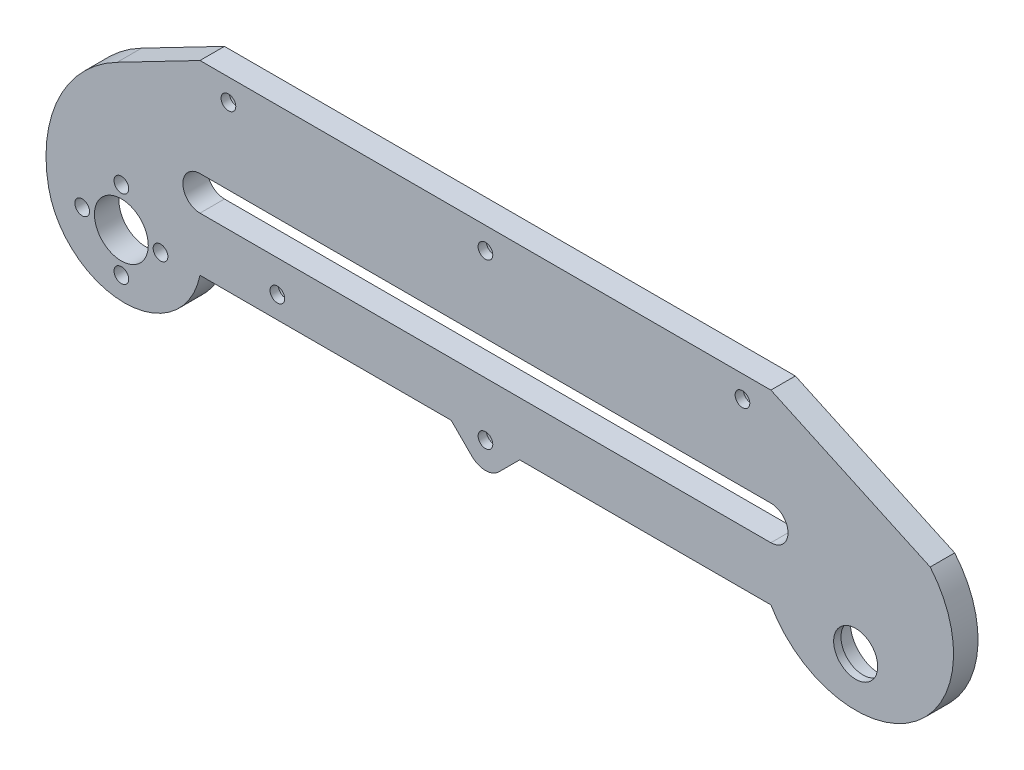
ISO-10303-21;
HEADER;
FILE_DESCRIPTION(('STEP AP214'),'2;1');
FILE_NAME('part.step','',(''),(''),'','','');
FILE_SCHEMA(('AUTOMOTIVE_DESIGN { 1 0 10303 214 1 1 1 1 }'));
ENDSEC;
DATA;
#1=APPLICATION_CONTEXT('core data for automotive mechanical design processes');
#2=APPLICATION_PROTOCOL_DEFINITION('international standard','automotive_design',2000,#1);
#3=PRODUCT_CONTEXT('',#1,'mechanical');
#4=PRODUCT('Part','Part','',(#3));
#5=PRODUCT_RELATED_PRODUCT_CATEGORY('part','',(#4));
#6=PRODUCT_DEFINITION_FORMATION('','',#4);
#7=PRODUCT_DEFINITION_CONTEXT('part definition',#1,'design');
#8=PRODUCT_DEFINITION('design','',#6,#7);
#9=PRODUCT_DEFINITION_SHAPE('','',#8);
#10=(LENGTH_UNIT() NAMED_UNIT(*) SI_UNIT(.MILLI.,.METRE.));
#11=(NAMED_UNIT(*) PLANE_ANGLE_UNIT() SI_UNIT($,.RADIAN.));
#12=(NAMED_UNIT(*) SI_UNIT($,.STERADIAN.) SOLID_ANGLE_UNIT());
#13=UNCERTAINTY_MEASURE_WITH_UNIT(LENGTH_MEASURE(1.E-05),#10,'distance_accuracy_value','');
#14=(GEOMETRIC_REPRESENTATION_CONTEXT(3) GLOBAL_UNCERTAINTY_ASSIGNED_CONTEXT((#13)) GLOBAL_UNIT_ASSIGNED_CONTEXT((#10,
#11,#12)) REPRESENTATION_CONTEXT('',''));
#15=CARTESIAN_POINT('',(0.,0.,0.));
#16=DIRECTION('',(0.,0.,1.));
#17=DIRECTION('',(1.,0.,0.));
#18=AXIS2_PLACEMENT_3D('',#15,#16,#17);
#19=CARTESIAN_POINT('',(0.,-15.003871014752,5.));
#20=DIRECTION('',(0.,0.,-1.));
#21=DIRECTION('',(-1.,0.,0.));
#22=AXIS2_PLACEMENT_3D('',#19,#20,#21);
#23=CYLINDRICAL_SURFACE('',#22,1.5);
#24=CARTESIAN_POINT('',(0.,-15.003871014752,5.));
#25=DIRECTION('',(0.,0.,1.));
#26=DIRECTION('',(1.,0.,0.));
#27=AXIS2_PLACEMENT_3D('',#24,#25,#26);
#28=CIRCLE('',#27,1.5);
#29=CARTESIAN_POINT('',(1.5,-15.003871014752,5.));
#30=VERTEX_POINT('',#29);
#31=EDGE_CURVE('E197',#30,#30,#28,.T.);
#32=ORIENTED_EDGE('',*,*,#31,.T.);
#33=EDGE_LOOP('',(#32));
#34=FACE_BOUND('',#33,.T.);
#35=CARTESIAN_POINT('',(0.,-15.003871014752,3.3));
#36=DIRECTION('',(0.,0.,-1.));
#37=DIRECTION('',(-1.,0.,0.));
#38=AXIS2_PLACEMENT_3D('',#35,#36,#37);
#39=CIRCLE('',#38,1.5);
#40=CARTESIAN_POINT('',(-1.5,-15.003871014752,3.3));
#41=VERTEX_POINT('',#40);
#42=EDGE_CURVE('E49',#41,#41,#39,.T.);
#43=ORIENTED_EDGE('',*,*,#42,.T.);
#44=EDGE_LOOP('',(#43));
#45=FACE_BOUND('',#44,.T.);
#46=ADVANCED_FACE('F45',(#34,#45),#23,.F.);
#47=CARTESIAN_POINT('',(0.,18.496128985248,5.));
#48=DIRECTION('',(0.,0.,-1.));
#49=DIRECTION('',(-1.,0.,0.));
#50=AXIS2_PLACEMENT_3D('',#47,#48,#49);
#51=CYLINDRICAL_SURFACE('',#50,1.5);
#52=CARTESIAN_POINT('',(0.,18.496128985248,5.));
#53=DIRECTION('',(0.,0.,-1.));
#54=DIRECTION('',(-1.,0.,0.));
#55=AXIS2_PLACEMENT_3D('',#52,#53,#54);
#56=CIRCLE('',#55,1.5);
#57=CARTESIAN_POINT('',(-1.5,18.496128985248,5.));
#58=VERTEX_POINT('',#57);
#59=EDGE_CURVE('E313',#58,#58,#56,.T.);
#60=ORIENTED_EDGE('',*,*,#59,.F.);
#61=EDGE_LOOP('',(#60));
#62=FACE_BOUND('',#61,.T.);
#63=CARTESIAN_POINT('',(0.,18.496128985248,3.3));
#64=DIRECTION('',(0.,0.,-1.));
#65=DIRECTION('',(-1.,0.,0.));
#66=AXIS2_PLACEMENT_3D('',#63,#64,#65);
#67=CIRCLE('',#66,1.5);
#68=CARTESIAN_POINT('',(-1.5,18.496128985248,3.3));
#69=VERTEX_POINT('',#68);
#70=EDGE_CURVE('E292',#69,#69,#67,.F.);
#71=ORIENTED_EDGE('',*,*,#70,.F.);
#72=EDGE_LOOP('',(#71));
#73=FACE_BOUND('',#72,.T.);
#74=ADVANCED_FACE('F381',(#62,#73),#51,.F.);
#75=CARTESIAN_POINT('',(-52.5,18.4961289852481,5.));
#76=DIRECTION('',(0.,0.,-1.));
#77=DIRECTION('',(-1.,0.,0.));
#78=AXIS2_PLACEMENT_3D('',#75,#76,#77);
#79=CYLINDRICAL_SURFACE('',#78,1.5);
#80=CARTESIAN_POINT('',(-52.5,18.4961289852481,5.));
#81=DIRECTION('',(0.,0.,-1.));
#82=DIRECTION('',(-1.,0.,0.));
#83=AXIS2_PLACEMENT_3D('',#80,#81,#82);
#84=CIRCLE('',#83,1.5);
#85=CARTESIAN_POINT('',(-54.,18.4961289852481,5.));
#86=VERTEX_POINT('',#85);
#87=EDGE_CURVE('E306',#86,#86,#84,.T.);
#88=ORIENTED_EDGE('',*,*,#87,.F.);
#89=EDGE_LOOP('',(#88));
#90=FACE_BOUND('',#89,.T.);
#91=CARTESIAN_POINT('',(-52.5,18.4961289852481,3.3));
#92=DIRECTION('',(0.,0.,-1.));
#93=DIRECTION('',(-1.,0.,0.));
#94=AXIS2_PLACEMENT_3D('',#91,#92,#93);
#95=CIRCLE('',#94,1.5);
#96=CARTESIAN_POINT('',(-54.,18.4961289852481,3.3));
#97=VERTEX_POINT('',#96);
#98=EDGE_CURVE('E290',#97,#97,#95,.F.);
#99=ORIENTED_EDGE('',*,*,#98,.F.);
#100=EDGE_LOOP('',(#99));
#101=FACE_BOUND('',#100,.T.);
#102=ADVANCED_FACE('F387',(#90,#101),#79,.F.);
#103=CARTESIAN_POINT('',(52.5,18.496128985248,5.));
#104=DIRECTION('',(0.,0.,-1.));
#105=DIRECTION('',(-1.,0.,0.));
#106=AXIS2_PLACEMENT_3D('',#103,#104,#105);
#107=CYLINDRICAL_SURFACE('',#106,1.5);
#108=CARTESIAN_POINT('',(52.5,18.496128985248,5.));
#109=DIRECTION('',(0.,0.,-1.));
#110=DIRECTION('',(-1.,0.,0.));
#111=AXIS2_PLACEMENT_3D('',#108,#109,#110);
#112=CIRCLE('',#111,1.5);
#113=CARTESIAN_POINT('',(51.,18.496128985248,5.));
#114=VERTEX_POINT('',#113);
#115=EDGE_CURVE('E301',#114,#114,#112,.T.);
#116=ORIENTED_EDGE('',*,*,#115,.F.);
#117=EDGE_LOOP('',(#116));
#118=FACE_BOUND('',#117,.T.);
#119=CARTESIAN_POINT('',(52.5,18.496128985248,3.3));
#120=DIRECTION('',(0.,0.,-1.));
#121=DIRECTION('',(-1.,0.,0.));
#122=AXIS2_PLACEMENT_3D('',#119,#120,#121);
#123=CIRCLE('',#122,1.5);
#124=CARTESIAN_POINT('',(51.,18.496128985248,3.3));
#125=VERTEX_POINT('',#124);
#126=EDGE_CURVE('E286',#125,#125,#123,.F.);
#127=ORIENTED_EDGE('',*,*,#126,.F.);
#128=EDGE_LOOP('',(#127));
#129=FACE_BOUND('',#128,.T.);
#130=ADVANCED_FACE('F429',(#118,#129),#107,.F.);
#131=CARTESIAN_POINT('',(-42.5,-10.5,10.));
#132=DIRECTION('',(0.,0.,-1.));
#133=DIRECTION('',(-1.,0.,0.));
#134=AXIS2_PLACEMENT_3D('',#131,#132,#133);
#135=CYLINDRICAL_SURFACE('',#134,1.5);
#136=CARTESIAN_POINT('',(-42.5,-10.5,5.));
#137=DIRECTION('',(0.,0.,-1.));
#138=DIRECTION('',(-1.,0.,0.));
#139=AXIS2_PLACEMENT_3D('',#136,#137,#138);
#140=CIRCLE('',#139,1.5);
#141=CARTESIAN_POINT('',(-44.,-10.5,5.));
#142=VERTEX_POINT('',#141);
#143=EDGE_CURVE('E297',#142,#142,#140,.T.);
#144=ORIENTED_EDGE('',*,*,#143,.F.);
#145=EDGE_LOOP('',(#144));
#146=FACE_BOUND('',#145,.T.);
#147=CARTESIAN_POINT('',(-42.5,-10.5,3.3));
#148=DIRECTION('',(0.,0.,-1.));
#149=DIRECTION('',(-1.,0.,0.));
#150=AXIS2_PLACEMENT_3D('',#147,#148,#149);
#151=CIRCLE('',#150,1.5);
#152=CARTESIAN_POINT('',(-44.,-10.5,3.3));
#153=VERTEX_POINT('',#152);
#154=EDGE_CURVE('E283',#153,#153,#151,.F.);
#155=ORIENTED_EDGE('',*,*,#154,.F.);
#156=EDGE_LOOP('',(#155));
#157=FACE_BOUND('',#156,.T.);
#158=ADVANCED_FACE('F410',(#146,#157),#135,.F.);
#159=CARTESIAN_POINT('',(75.6291845871765,-15.,5.));
#160=DIRECTION('',(0.,0.,-1.));
#161=DIRECTION('',(-1.,0.,0.));
#162=AXIS2_PLACEMENT_3D('',#159,#160,#161);
#163=CYLINDRICAL_SURFACE('',#162,4.5);
#164=CARTESIAN_POINT('',(75.6291845871765,-15.,5.));
#165=DIRECTION('',(0.,0.,1.));
#166=DIRECTION('',(1.,0.,0.));
#167=AXIS2_PLACEMENT_3D('',#164,#165,#166);
#168=CIRCLE('',#167,4.5);
#169=CARTESIAN_POINT('',(80.1291845871765,-15.,5.));
#170=VERTEX_POINT('',#169);
#171=EDGE_CURVE('E184',#170,#170,#168,.T.);
#172=ORIENTED_EDGE('',*,*,#171,.T.);
#173=EDGE_LOOP('',(#172));
#174=FACE_BOUND('',#173,.T.);
#175=CARTESIAN_POINT('',(75.6291845871765,-15.,3.5));
#176=DIRECTION('',(0.,0.,-1.));
#177=DIRECTION('',(-1.,0.,0.));
#178=AXIS2_PLACEMENT_3D('',#175,#176,#177);
#179=CIRCLE('',#178,4.5);
#180=CARTESIAN_POINT('',(71.1291845871765,-15.,3.5));
#181=VERTEX_POINT('',#180);
#182=EDGE_CURVE('E278',#181,#181,#179,.T.);
#183=ORIENTED_EDGE('',*,*,#182,.T.);
#184=EDGE_LOOP('',(#183));
#185=FACE_BOUND('',#184,.T.);
#186=ADVANCED_FACE('F347',(#174,#185),#163,.F.);
#187=CARTESIAN_POINT('',(-73.7629807502651,-11.8268950204284,5.));
#188=DIRECTION('',(0.,0.,-1.));
#189=DIRECTION('',(-1.,0.,0.));
#190=AXIS2_PLACEMENT_3D('',#187,#188,#189);
#191=PLANE('',#190);
#192=ORIENTED_EDGE('',*,*,#143,.T.);
#193=EDGE_LOOP('',(#192));
#194=FACE_BOUND('',#193,.T.);
#195=ORIENTED_EDGE('',*,*,#115,.T.);
#196=EDGE_LOOP('',(#195));
#197=FACE_BOUND('',#196,.T.);
#198=ORIENTED_EDGE('',*,*,#87,.T.);
#199=EDGE_LOOP('',(#198));
#200=FACE_BOUND('',#199,.T.);
#201=ORIENTED_EDGE('',*,*,#59,.T.);
#202=EDGE_LOOP('',(#201));
#203=FACE_BOUND('',#202,.T.);
#204=CARTESIAN_POINT('',(-74.3708154128235,-15.,5.));
#205=DIRECTION('',(0.,0.,1.));
#206=DIRECTION('',(1.,0.,0.));
#207=AXIS2_PLACEMENT_3D('',#204,#205,#206);
#208=CIRCLE('',#207,5.5);
#209=CARTESIAN_POINT('',(-68.8708154128235,-15.,5.));
#210=VERTEX_POINT('',#209);
#211=EDGE_CURVE('E194',#210,#210,#208,.T.);
#212=ORIENTED_EDGE('',*,*,#211,.F.);
#213=EDGE_LOOP('',(#212));
#214=FACE_BOUND('',#213,.T.);
#215=ORIENTED_EDGE('',*,*,#31,.F.);
#216=EDGE_LOOP('',(#215));
#217=FACE_BOUND('',#216,.T.);
#218=CARTESIAN_POINT('',(-73.7629807502651,-11.8268950204284,5.));
#219=DIRECTION('',(0.,0.,1.));
#220=DIRECTION('',(-1.,0.,0.));
#221=AXIS2_PLACEMENT_3D('',#218,#219,#220);
#222=CIRCLE('',#221,15.7766953040254);
#223=CARTESIAN_POINT('',(-89.217284989042,-15.,5.));
#224=VERTEX_POINT('',#223);
#225=CARTESIAN_POINT('',(-58.3086765114883,-15.,5.));
#226=VERTEX_POINT('',#225);
#227=EDGE_CURVE('E203',#224,#226,#222,.T.);
#228=ORIENTED_EDGE('',*,*,#227,.T.);
#229=DIRECTION('',(1.,0.,0.));
#230=VECTOR('',#229,1.);
#231=CARTESIAN_POINT('',(-58.3086765114883,-15.,5.));
#232=LINE('',#231,#230);
#233=CARTESIAN_POINT('',(-7.,-15.,5.));
#234=VERTEX_POINT('',#233);
#235=EDGE_CURVE('E206',#226,#234,#232,.T.);
#236=ORIENTED_EDGE('',*,*,#235,.T.);
#237=DIRECTION('',(0.707106781186546,-0.707106781186549,0.));
#238=VECTOR('',#237,1.);
#239=CARTESIAN_POINT('',(-7.,-15.,5.));
#240=LINE('',#239,#238);
#241=CARTESIAN_POINT('',(-2.75735931288071,-19.2426406871193,5.));
#242=VERTEX_POINT('',#241);
#243=EDGE_CURVE('E209',#234,#242,#240,.T.);
#244=ORIENTED_EDGE('',*,*,#243,.T.);
#245=CARTESIAN_POINT('',(0.,-16.4852813742386,5.));
#246=DIRECTION('',(0.,0.,1.));
#247=DIRECTION('',(1.,0.,0.));
#248=AXIS2_PLACEMENT_3D('',#245,#246,#247);
#249=CIRCLE('',#248,3.89949493661164);
#250=CARTESIAN_POINT('',(2.75735931288073,-19.2426406871193,5.));
#251=VERTEX_POINT('',#250);
#252=EDGE_CURVE('E211',#242,#251,#249,.T.);
#253=ORIENTED_EDGE('',*,*,#252,.T.);
#254=DIRECTION('',(0.707106781186544,0.707106781186551,0.));
#255=VECTOR('',#254,1.);
#256=CARTESIAN_POINT('',(7.,-15.,5.));
#257=LINE('',#256,#255);
#258=CARTESIAN_POINT('',(7.,-15.,5.));
#259=VERTEX_POINT('',#258);
#260=EDGE_CURVE('E213',#251,#259,#257,.T.);
#261=ORIENTED_EDGE('',*,*,#260,.T.);
#262=DIRECTION('',(1.,0.,0.));
#263=VECTOR('',#262,1.);
#264=CARTESIAN_POINT('',(58.3086765114877,-15.,5.));
#265=LINE('',#264,#263);
#266=CARTESIAN_POINT('',(58.3086765114877,-15.,5.));
#267=VERTEX_POINT('',#266);
#268=EDGE_CURVE('E215',#259,#267,#265,.T.);
#269=ORIENTED_EDGE('',*,*,#268,.T.);
#270=CARTESIAN_POINT('',(75.6291845871765,-4.99999999999999,5.));
#271=DIRECTION('',(0.,0.,1.));
#272=DIRECTION('',(-1.,0.,0.));
#273=AXIS2_PLACEMENT_3D('',#270,#271,#272);
#274=CIRCLE('',#273,20.0000000000002);
#275=CARTESIAN_POINT('',(90.8512264399458,7.97264205289539,5.));
#276=VERTEX_POINT('',#275);
#277=EDGE_CURVE('E217',#267,#276,#274,.T.);
#278=ORIENTED_EDGE('',*,*,#277,.T.);
#279=DIRECTION('',(-0.907918526808646,0.419146691120922,0.));
#280=VECTOR('',#279,1.);
#281=CARTESIAN_POINT('',(75.6291845871769,15.0000000000002,5.));
#282=LINE('',#281,#280);
#283=CARTESIAN_POINT('',(58.3086765114883,22.996128985248,5.));
#284=VERTEX_POINT('',#283);
#285=EDGE_CURVE('E219',#276,#284,#282,.T.);
#286=ORIENTED_EDGE('',*,*,#285,.T.);
#287=DIRECTION('',(-1.,0.,0.));
#288=VECTOR('',#287,1.);
#289=CARTESIAN_POINT('',(-58.3086765114883,22.996128985248,5.));
#290=LINE('',#289,#288);
#291=CARTESIAN_POINT('',(-58.3086765114883,22.996128985248,5.));
#292=VERTEX_POINT('',#291);
#293=EDGE_CURVE('E221',#284,#292,#290,.T.);
#294=ORIENTED_EDGE('',*,*,#293,.T.);
#295=DIRECTION('',(-0.887710105258245,-0.460402833421338,0.));
#296=VECTOR('',#295,1.);
#297=CARTESIAN_POINT('',(-58.3086765114883,22.996128985248,5.));
#298=LINE('',#297,#296);
#299=CARTESIAN_POINT('',(-75.2436652720342,14.2129499236042,5.));
#300=VERTEX_POINT('',#299);
#301=EDGE_CURVE('E223',#292,#300,#298,.T.);
#302=ORIENTED_EDGE('',*,*,#301,.T.);
#303=CARTESIAN_POINT('',(-62.9636397673244,-9.60955529942828,5.));
#304=DIRECTION('',(0.,0.,1.));
#305=DIRECTION('',(-1.,0.,0.));
#306=AXIS2_PLACEMENT_3D('',#303,#304,#305);
#307=CIRCLE('',#306,26.8013205177979);
#308=EDGE_CURVE('E225',#300,#224,#307,.T.);
#309=ORIENTED_EDGE('',*,*,#308,.T.);
#310=EDGE_LOOP('',(#228,#236,#244,#253,#261,#269,#278,#286,#294,#302,#309));
#311=FACE_BOUND('',#310,.T.);
#312=CARTESIAN_POINT('',(-58.3086765114883,-0.503871014751975,5.));
#313=DIRECTION('',(0.,0.,1.));
#314=DIRECTION('',(1.,0.,0.));
#315=AXIS2_PLACEMENT_3D('',#312,#313,#314);
#316=CIRCLE('',#315,3.5);
#317=CARTESIAN_POINT('',(-58.3086765114883,2.99612898524804,5.));
#318=VERTEX_POINT('',#317);
#319=CARTESIAN_POINT('',(-58.3086765114883,-4.00387101475196,5.));
#320=VERTEX_POINT('',#319);
#321=EDGE_CURVE('E154',#318,#320,#316,.T.);
#322=ORIENTED_EDGE('',*,*,#321,.F.);
#323=DIRECTION('',(-1.,0.,0.));
#324=VECTOR('',#323,1.);
#325=CARTESIAN_POINT('',(-58.3086765114883,2.99612898524804,5.));
#326=LINE('',#325,#324);
#327=CARTESIAN_POINT('',(58.3086765114883,2.99612898524806,5.));
#328=VERTEX_POINT('',#327);
#329=EDGE_CURVE('E178',#328,#318,#326,.T.);
#330=ORIENTED_EDGE('',*,*,#329,.F.);
#331=CARTESIAN_POINT('',(58.3086765114883,-0.50387101475194,5.));
#332=DIRECTION('',(0.,0.,1.));
#333=DIRECTION('',(-1.,0.,0.));
#334=AXIS2_PLACEMENT_3D('',#331,#332,#333);
#335=CIRCLE('',#334,3.5);
#336=CARTESIAN_POINT('',(58.3086765114883,-4.00387101475194,5.));
#337=VERTEX_POINT('',#336);
#338=EDGE_CURVE('E176',#337,#328,#335,.T.);
#339=ORIENTED_EDGE('',*,*,#338,.F.);
#340=DIRECTION('',(1.,0.,0.));
#341=VECTOR('',#340,1.);
#342=CARTESIAN_POINT('',(-58.3086765114883,-4.00387101475196,5.));
#343=LINE('',#342,#341);
#344=EDGE_CURVE('E162',#320,#337,#343,.T.);
#345=ORIENTED_EDGE('',*,*,#344,.F.);
#346=EDGE_LOOP('',(#322,#330,#339,#345));
#347=FACE_BOUND('',#346,.T.);
#348=ORIENTED_EDGE('',*,*,#171,.F.);
#349=EDGE_LOOP('',(#348));
#350=FACE_BOUND('',#349,.T.);
#351=CARTESIAN_POINT('',(-74.3708154128212,-7.00000000000001,5.));
#352=DIRECTION('',(0.,0.,1.));
#353=DIRECTION('',(-1.,0.,0.));
#354=AXIS2_PLACEMENT_3D('',#351,#352,#353);
#355=CIRCLE('',#354,1.49999999999777);
#356=CARTESIAN_POINT('',(-75.8708154128189,-7.00000000000001,5.));
#357=VERTEX_POINT('',#356);
#358=EDGE_CURVE('E340',#357,#357,#355,.T.);
#359=ORIENTED_EDGE('',*,*,#358,.F.);
#360=EDGE_LOOP('',(#359));
#361=FACE_BOUND('',#360,.T.);
#362=CARTESIAN_POINT('',(-66.3708154128233,-14.9999999999998,5.));
#363=DIRECTION('',(0.,0.,1.));
#364=DIRECTION('',(-1.,0.,0.));
#365=AXIS2_PLACEMENT_3D('',#362,#363,#364);
#366=CIRCLE('',#365,1.5);
#367=CARTESIAN_POINT('',(-67.8708154128233,-14.9999999999998,5.));
#368=VERTEX_POINT('',#367);
#369=EDGE_CURVE('E334',#368,#368,#366,.T.);
#370=ORIENTED_EDGE('',*,*,#369,.F.);
#371=EDGE_LOOP('',(#370));
#372=FACE_BOUND('',#371,.T.);
#373=CARTESIAN_POINT('',(-74.3708154128231,-22.9999999999977,5.));
#374=DIRECTION('',(0.,0.,1.));
#375=DIRECTION('',(-1.,0.,0.));
#376=AXIS2_PLACEMENT_3D('',#373,#374,#375);
#377=CIRCLE('',#376,1.50000000000069);
#378=CARTESIAN_POINT('',(-75.8708154128238,-22.9999999999977,5.));
#379=VERTEX_POINT('',#378);
#380=EDGE_CURVE('E328',#379,#379,#377,.T.);
#381=ORIENTED_EDGE('',*,*,#380,.F.);
#382=EDGE_LOOP('',(#381));
#383=FACE_BOUND('',#382,.T.);
#384=CARTESIAN_POINT('',(-82.370815412821,-14.9999999999979,5.));
#385=DIRECTION('',(0.,0.,1.));
#386=DIRECTION('',(-1.,0.,0.));
#387=AXIS2_PLACEMENT_3D('',#384,#385,#386);
#388=CIRCLE('',#387,1.49999999999849);
#389=CARTESIAN_POINT('',(-83.8708154128195,-14.9999999999979,5.));
#390=VERTEX_POINT('',#389);
#391=EDGE_CURVE('E322',#390,#390,#388,.T.);
#392=ORIENTED_EDGE('',*,*,#391,.F.);
#393=EDGE_LOOP('',(#392));
#394=FACE_BOUND('',#393,.T.);
#395=ADVANCED_FACE('F174',(#194,#197,#200,#203,#214,#217,#311,#347,#350,#361,#372,#383,#394),
#191,.F.);
#396=CARTESIAN_POINT('',(-73.7629807502651,-11.8268950204284,0.));
#397=DIRECTION('',(0.,0.,-1.));
#398=DIRECTION('',(-1.,0.,0.));
#399=AXIS2_PLACEMENT_3D('',#396,#397,#398);
#400=PLANE('',#399);
#401=CARTESIAN_POINT('',(0.,-15.003871014752,0.));
#402=DIRECTION('',(0.,0.,-1.));
#403=DIRECTION('',(-1.,0.,0.));
#404=AXIS2_PLACEMENT_3D('',#401,#402,#403);
#405=CIRCLE('',#404,2.9);
#406=CARTESIAN_POINT('',(-2.9,-15.003871014752,0.));
#407=VERTEX_POINT('',#406);
#408=EDGE_CURVE('E500',#407,#407,#405,.T.);
#409=ORIENTED_EDGE('',*,*,#408,.F.);
#410=EDGE_LOOP('',(#409));
#411=FACE_BOUND('',#410,.T.);
#412=CARTESIAN_POINT('',(0.,18.496128985248,0.));
#413=DIRECTION('',(0.,0.,-1.));
#414=DIRECTION('',(-1.,0.,0.));
#415=AXIS2_PLACEMENT_3D('',#412,#413,#414);
#416=CIRCLE('',#415,2.9);
#417=CARTESIAN_POINT('',(-2.9,18.496128985248,0.));
#418=VERTEX_POINT('',#417);
#419=EDGE_CURVE('E490',#418,#418,#416,.T.);
#420=ORIENTED_EDGE('',*,*,#419,.F.);
#421=EDGE_LOOP('',(#420));
#422=FACE_BOUND('',#421,.T.);
#423=CARTESIAN_POINT('',(-52.5,18.4961289852481,0.));
#424=DIRECTION('',(0.,0.,-1.));
#425=DIRECTION('',(-1.,0.,0.));
#426=AXIS2_PLACEMENT_3D('',#423,#424,#425);
#427=CIRCLE('',#426,2.9);
#428=CARTESIAN_POINT('',(-55.4,18.4961289852481,0.));
#429=VERTEX_POINT('',#428);
#430=EDGE_CURVE('E485',#429,#429,#427,.T.);
#431=ORIENTED_EDGE('',*,*,#430,.F.);
#432=EDGE_LOOP('',(#431));
#433=FACE_BOUND('',#432,.T.);
#434=CARTESIAN_POINT('',(52.5,18.496128985248,0.));
#435=DIRECTION('',(0.,0.,-1.));
#436=DIRECTION('',(-1.,0.,0.));
#437=AXIS2_PLACEMENT_3D('',#434,#435,#436);
#438=CIRCLE('',#437,2.9);
#439=CARTESIAN_POINT('',(49.6,18.496128985248,0.));
#440=VERTEX_POINT('',#439);
#441=EDGE_CURVE('E492',#440,#440,#438,.T.);
#442=ORIENTED_EDGE('',*,*,#441,.F.);
#443=EDGE_LOOP('',(#442));
#444=FACE_BOUND('',#443,.T.);
#445=CARTESIAN_POINT('',(-42.5,-10.5,0.));
#446=DIRECTION('',(0.,0.,-1.));
#447=DIRECTION('',(-1.,0.,0.));
#448=AXIS2_PLACEMENT_3D('',#445,#446,#447);
#449=CIRCLE('',#448,2.9);
#450=CARTESIAN_POINT('',(-45.4,-10.5,0.));
#451=VERTEX_POINT('',#450);
#452=EDGE_CURVE('E310',#451,#451,#449,.T.);
#453=ORIENTED_EDGE('',*,*,#452,.F.);
#454=EDGE_LOOP('',(#453));
#455=FACE_BOUND('',#454,.T.);
#456=CARTESIAN_POINT('',(75.6291845871765,-15.,0.));
#457=DIRECTION('',(0.,0.,-1.));
#458=DIRECTION('',(-1.,0.,0.));
#459=AXIS2_PLACEMENT_3D('',#456,#457,#458);
#460=CIRCLE('',#459,6.1);
#461=CARTESIAN_POINT('',(69.5291845871765,-15.,0.));
#462=VERTEX_POINT('',#461);
#463=EDGE_CURVE('E317',#462,#462,#460,.T.);
#464=ORIENTED_EDGE('',*,*,#463,.F.);
#465=EDGE_LOOP('',(#464));
#466=FACE_BOUND('',#465,.T.);
#467=CARTESIAN_POINT('',(-74.3708154128231,-22.9999999999977,0.));
#468=DIRECTION('',(0.,0.,1.));
#469=DIRECTION('',(-1.,0.,0.));
#470=AXIS2_PLACEMENT_3D('',#467,#468,#469);
#471=CIRCLE('',#470,1.50000000000069);
#472=CARTESIAN_POINT('',(-75.8708154128238,-22.9999999999977,0.));
#473=VERTEX_POINT('',#472);
#474=EDGE_CURVE('E325',#473,#473,#471,.T.);
#475=ORIENTED_EDGE('',*,*,#474,.T.);
#476=EDGE_LOOP('',(#475));
#477=FACE_BOUND('',#476,.T.);
#478=CARTESIAN_POINT('',(-74.3708154128212,-7.00000000000001,0.));
#479=DIRECTION('',(0.,0.,1.));
#480=DIRECTION('',(-1.,0.,0.));
#481=AXIS2_PLACEMENT_3D('',#478,#479,#480);
#482=CIRCLE('',#481,1.49999999999777);
#483=CARTESIAN_POINT('',(-75.8708154128189,-7.00000000000001,0.));
#484=VERTEX_POINT('',#483);
#485=EDGE_CURVE('E337',#484,#484,#482,.T.);
#486=ORIENTED_EDGE('',*,*,#485,.T.);
#487=EDGE_LOOP('',(#486));
#488=FACE_BOUND('',#487,.T.);
#489=DIRECTION('',(-1.,0.,0.));
#490=VECTOR('',#489,1.);
#491=CARTESIAN_POINT('',(-58.3086765114883,2.99612898524804,0.));
#492=LINE('',#491,#490);
#493=CARTESIAN_POINT('',(58.3086765114883,2.99612898524806,0.));
#494=VERTEX_POINT('',#493);
#495=CARTESIAN_POINT('',(-58.3086765114883,2.99612898524804,0.));
#496=VERTEX_POINT('',#495);
#497=EDGE_CURVE('E163',#494,#496,#492,.T.);
#498=ORIENTED_EDGE('',*,*,#497,.T.);
#499=CARTESIAN_POINT('',(-58.3086765114883,-0.503871014751975,0.));
#500=DIRECTION('',(0.,0.,1.));
#501=DIRECTION('',(1.,0.,0.));
#502=AXIS2_PLACEMENT_3D('',#499,#500,#501);
#503=CIRCLE('',#502,3.5);
#504=CARTESIAN_POINT('',(-58.3086765114883,-4.00387101475196,0.));
#505=VERTEX_POINT('',#504);
#506=EDGE_CURVE('E70',#496,#505,#503,.T.);
#507=ORIENTED_EDGE('',*,*,#506,.T.);
#508=DIRECTION('',(1.,0.,0.));
#509=VECTOR('',#508,1.);
#510=CARTESIAN_POINT('',(-58.3086765114883,-4.00387101475196,0.));
#511=LINE('',#510,#509);
#512=CARTESIAN_POINT('',(58.3086765114883,-4.00387101475194,0.));
#513=VERTEX_POINT('',#512);
#514=EDGE_CURVE('E169',#505,#513,#511,.T.);
#515=ORIENTED_EDGE('',*,*,#514,.T.);
#516=CARTESIAN_POINT('',(58.3086765114883,-0.50387101475194,0.));
#517=DIRECTION('',(0.,0.,1.));
#518=DIRECTION('',(-1.,0.,0.));
#519=AXIS2_PLACEMENT_3D('',#516,#517,#518);
#520=CIRCLE('',#519,3.5);
#521=EDGE_CURVE('E186',#513,#494,#520,.T.);
#522=ORIENTED_EDGE('',*,*,#521,.T.);
#523=EDGE_LOOP('',(#498,#507,#515,#522));
#524=FACE_BOUND('',#523,.T.);
#525=CARTESIAN_POINT('',(-74.3708154128235,-15.,0.));
#526=DIRECTION('',(0.,0.,1.));
#527=DIRECTION('',(1.,0.,0.));
#528=AXIS2_PLACEMENT_3D('',#525,#526,#527);
#529=CIRCLE('',#528,5.5);
#530=CARTESIAN_POINT('',(-68.8708154128235,-15.,0.));
#531=VERTEX_POINT('',#530);
#532=EDGE_CURVE('E170',#531,#531,#529,.T.);
#533=ORIENTED_EDGE('',*,*,#532,.T.);
#534=EDGE_LOOP('',(#533));
#535=FACE_BOUND('',#534,.T.);
#536=CARTESIAN_POINT('',(-73.7629807502651,-11.8268950204284,0.));
#537=DIRECTION('',(0.,0.,1.));
#538=DIRECTION('',(-1.,0.,0.));
#539=AXIS2_PLACEMENT_3D('',#536,#537,#538);
#540=CIRCLE('',#539,15.7766953040254);
#541=CARTESIAN_POINT('',(-89.217284989042,-15.,0.));
#542=VERTEX_POINT('',#541);
#543=CARTESIAN_POINT('',(-58.3086765114883,-15.,0.));
#544=VERTEX_POINT('',#543);
#545=EDGE_CURVE('E202',#542,#544,#540,.T.);
#546=ORIENTED_EDGE('',*,*,#545,.F.);
#547=CARTESIAN_POINT('',(-62.9636397673244,-9.60955529942828,0.));
#548=DIRECTION('',(0.,0.,1.));
#549=DIRECTION('',(-1.,0.,0.));
#550=AXIS2_PLACEMENT_3D('',#547,#548,#549);
#551=CIRCLE('',#550,26.8013205177979);
#552=CARTESIAN_POINT('',(-75.2436652720342,14.2129499236042,0.));
#553=VERTEX_POINT('',#552);
#554=EDGE_CURVE('E207',#553,#542,#551,.T.);
#555=ORIENTED_EDGE('',*,*,#554,.F.);
#556=DIRECTION('',(-0.887710105258245,-0.460402833421338,0.));
#557=VECTOR('',#556,1.);
#558=CARTESIAN_POINT('',(-58.3086765114883,22.996128985248,0.));
#559=LINE('',#558,#557);
#560=CARTESIAN_POINT('',(-58.3086765114883,22.996128985248,0.));
#561=VERTEX_POINT('',#560);
#562=EDGE_CURVE('E247',#561,#553,#559,.T.);
#563=ORIENTED_EDGE('',*,*,#562,.F.);
#564=DIRECTION('',(-1.,0.,0.));
#565=VECTOR('',#564,1.);
#566=CARTESIAN_POINT('',(-58.3086765114883,22.996128985248,0.));
#567=LINE('',#566,#565);
#568=CARTESIAN_POINT('',(58.3086765114883,22.996128985248,0.));
#569=VERTEX_POINT('',#568);
#570=EDGE_CURVE('E245',#569,#561,#567,.T.);
#571=ORIENTED_EDGE('',*,*,#570,.F.);
#572=DIRECTION('',(-0.907918526808646,0.419146691120922,0.));
#573=VECTOR('',#572,1.);
#574=CARTESIAN_POINT('',(75.6291845871769,15.0000000000002,0.));
#575=LINE('',#574,#573);
#576=CARTESIAN_POINT('',(90.8512264399458,7.97264205289539,0.));
#577=VERTEX_POINT('',#576);
#578=EDGE_CURVE('E243',#577,#569,#575,.T.);
#579=ORIENTED_EDGE('',*,*,#578,.F.);
#580=CARTESIAN_POINT('',(75.6291845871765,-4.99999999999999,0.));
#581=DIRECTION('',(0.,0.,1.));
#582=DIRECTION('',(-1.,0.,0.));
#583=AXIS2_PLACEMENT_3D('',#580,#581,#582);
#584=CIRCLE('',#583,20.0000000000002);
#585=CARTESIAN_POINT('',(58.3086765114877,-15.,0.));
#586=VERTEX_POINT('',#585);
#587=EDGE_CURVE('E240',#586,#577,#584,.T.);
#588=ORIENTED_EDGE('',*,*,#587,.F.);
#589=DIRECTION('',(1.,0.,0.));
#590=VECTOR('',#589,1.);
#591=CARTESIAN_POINT('',(58.3086765114877,-15.,0.));
#592=LINE('',#591,#590);
#593=CARTESIAN_POINT('',(7.,-15.,0.));
#594=VERTEX_POINT('',#593);
#595=EDGE_CURVE('E238',#594,#586,#592,.T.);
#596=ORIENTED_EDGE('',*,*,#595,.F.);
#597=DIRECTION('',(0.707106781186544,0.707106781186551,0.));
#598=VECTOR('',#597,1.);
#599=CARTESIAN_POINT('',(7.,-15.,0.));
#600=LINE('',#599,#598);
#601=CARTESIAN_POINT('',(2.75735931288073,-19.2426406871193,0.));
#602=VERTEX_POINT('',#601);
#603=EDGE_CURVE('E236',#602,#594,#600,.T.);
#604=ORIENTED_EDGE('',*,*,#603,.F.);
#605=CARTESIAN_POINT('',(0.,-16.4852813742386,0.));
#606=DIRECTION('',(0.,0.,1.));
#607=DIRECTION('',(1.,0.,0.));
#608=AXIS2_PLACEMENT_3D('',#605,#606,#607);
#609=CIRCLE('',#608,3.89949493661164);
#610=CARTESIAN_POINT('',(-2.75735931288071,-19.2426406871193,0.));
#611=VERTEX_POINT('',#610);
#612=EDGE_CURVE('E234',#611,#602,#609,.T.);
#613=ORIENTED_EDGE('',*,*,#612,.F.);
#614=DIRECTION('',(0.707106781186546,-0.707106781186549,0.));
#615=VECTOR('',#614,1.);
#616=CARTESIAN_POINT('',(-7.,-15.,0.));
#617=LINE('',#616,#615);
#618=CARTESIAN_POINT('',(-7.,-15.,0.));
#619=VERTEX_POINT('',#618);
#620=EDGE_CURVE('E232',#619,#611,#617,.T.);
#621=ORIENTED_EDGE('',*,*,#620,.F.);
#622=DIRECTION('',(1.,0.,0.));
#623=VECTOR('',#622,1.);
#624=CARTESIAN_POINT('',(-58.3086765114883,-15.,0.));
#625=LINE('',#624,#623);
#626=EDGE_CURVE('E230',#544,#619,#625,.T.);
#627=ORIENTED_EDGE('',*,*,#626,.F.);
#628=EDGE_LOOP('',(#546,#555,#563,#571,#579,#588,#596,#604,#613,#621,#627));
#629=FACE_BOUND('',#628,.T.);
#630=CARTESIAN_POINT('',(-66.3708154128233,-14.9999999999998,0.));
#631=DIRECTION('',(0.,0.,1.));
#632=DIRECTION('',(-1.,0.,0.));
#633=AXIS2_PLACEMENT_3D('',#630,#631,#632);
#634=CIRCLE('',#633,1.5);
#635=CARTESIAN_POINT('',(-67.8708154128233,-14.9999999999998,0.));
#636=VERTEX_POINT('',#635);
#637=EDGE_CURVE('E331',#636,#636,#634,.T.);
#638=ORIENTED_EDGE('',*,*,#637,.T.);
#639=EDGE_LOOP('',(#638));
#640=FACE_BOUND('',#639,.T.);
#641=CARTESIAN_POINT('',(-82.370815412821,-14.9999999999979,0.));
#642=DIRECTION('',(0.,0.,1.));
#643=DIRECTION('',(-1.,0.,0.));
#644=AXIS2_PLACEMENT_3D('',#641,#642,#643);
#645=CIRCLE('',#644,1.49999999999849);
#646=CARTESIAN_POINT('',(-83.8708154128195,-14.9999999999979,0.));
#647=VERTEX_POINT('',#646);
#648=EDGE_CURVE('E281',#647,#647,#645,.T.);
#649=ORIENTED_EDGE('',*,*,#648,.T.);
#650=EDGE_LOOP('',(#649));
#651=FACE_BOUND('',#650,.T.);
#652=ADVANCED_FACE('F351',(#411,#422,#433,#444,#455,#466,#477,#488,#524,#535,#629,#640,#651),
#400,.T.);
#653=CARTESIAN_POINT('',(-73.7629807502651,-11.8268950204284,5.));
#654=DIRECTION('',(0.,0.,-1.));
#655=DIRECTION('',(-1.,0.,0.));
#656=AXIS2_PLACEMENT_3D('',#653,#654,#655);
#657=CYLINDRICAL_SURFACE('',#656,15.7766953040254);
#658=ORIENTED_EDGE('',*,*,#545,.T.);
#659=DIRECTION('',(0.,0.,-1.));
#660=VECTOR('',#659,1.);
#661=CARTESIAN_POINT('',(-58.3086765114883,-15.,5.));
#662=LINE('',#661,#660);
#663=EDGE_CURVE('E11',#226,#544,#662,.T.);
#664=ORIENTED_EDGE('',*,*,#663,.F.);
#665=ORIENTED_EDGE('',*,*,#227,.F.);
#666=DIRECTION('',(0.,0.,-1.));
#667=VECTOR('',#666,1.);
#668=CARTESIAN_POINT('',(-89.217284989042,-15.,5.));
#669=LINE('',#668,#667);
#670=EDGE_CURVE('E227',#224,#542,#669,.T.);
#671=ORIENTED_EDGE('',*,*,#670,.T.);
#672=EDGE_LOOP('',(#658,#664,#665,#671));
#673=FACE_BOUND('',#672,.T.);
#674=ADVANCED_FACE('F47',(#673),#657,.T.);
#675=CARTESIAN_POINT('',(-58.3086765114883,-15.,5.));
#676=DIRECTION('',(0.,1.,0.));
#677=DIRECTION('',(0.,0.,1.));
#678=AXIS2_PLACEMENT_3D('',#675,#676,#677);
#679=PLANE('',#678);
#680=ORIENTED_EDGE('',*,*,#626,.T.);
#681=DIRECTION('',(0.,0.,-1.));
#682=VECTOR('',#681,1.);
#683=CARTESIAN_POINT('',(-7.,-15.,5.));
#684=LINE('',#683,#682);
#685=EDGE_CURVE('E54',#234,#619,#684,.T.);
#686=ORIENTED_EDGE('',*,*,#685,.F.);
#687=ORIENTED_EDGE('',*,*,#235,.F.);
#688=ORIENTED_EDGE('',*,*,#663,.T.);
#689=EDGE_LOOP('',(#680,#686,#687,#688));
#690=FACE_BOUND('',#689,.T.);
#691=ADVANCED_FACE('F375',(#690),#679,.F.);
#692=CARTESIAN_POINT('',(-7.,-15.,5.));
#693=DIRECTION('',(0.707106781186549,0.707106781186546,0.));
#694=DIRECTION('',(-0.707106781186546,0.707106781186549,0.));
#695=AXIS2_PLACEMENT_3D('',#692,#693,#694);
#696=PLANE('',#695);
#697=ORIENTED_EDGE('',*,*,#620,.T.);
#698=DIRECTION('',(0.,0.,-1.));
#699=VECTOR('',#698,1.);
#700=CARTESIAN_POINT('',(-2.75735931288071,-19.2426406871193,5.));
#701=LINE('',#700,#699);
#702=EDGE_CURVE('E273',#242,#611,#701,.T.);
#703=ORIENTED_EDGE('',*,*,#702,.F.);
#704=ORIENTED_EDGE('',*,*,#243,.F.);
#705=ORIENTED_EDGE('',*,*,#685,.T.);
#706=EDGE_LOOP('',(#697,#703,#704,#705));
#707=FACE_BOUND('',#706,.T.);
#708=ADVANCED_FACE('F570',(#707),#696,.F.);
#709=CARTESIAN_POINT('',(0.,-16.4852813742386,5.));
#710=DIRECTION('',(0.,0.,-1.));
#711=DIRECTION('',(-1.,0.,0.));
#712=AXIS2_PLACEMENT_3D('',#709,#710,#711);
#713=CYLINDRICAL_SURFACE('',#712,3.89949493661164);
#714=ORIENTED_EDGE('',*,*,#612,.T.);
#715=DIRECTION('',(0.,0.,-1.));
#716=VECTOR('',#715,1.);
#717=CARTESIAN_POINT('',(2.75735931288073,-19.2426406871193,5.));
#718=LINE('',#717,#716);
#719=EDGE_CURVE('E270',#251,#602,#718,.T.);
#720=ORIENTED_EDGE('',*,*,#719,.F.);
#721=ORIENTED_EDGE('',*,*,#252,.F.);
#722=ORIENTED_EDGE('',*,*,#702,.T.);
#723=EDGE_LOOP('',(#714,#720,#721,#722));
#724=FACE_BOUND('',#723,.T.);
#725=ADVANCED_FACE('F567',(#724),#713,.T.);
#726=CARTESIAN_POINT('',(7.,-15.,5.));
#727=DIRECTION('',(-0.707106781186551,0.707106781186544,0.));
#728=DIRECTION('',(-0.707106781186544,-0.707106781186551,0.));
#729=AXIS2_PLACEMENT_3D('',#726,#727,#728);
#730=PLANE('',#729);
#731=ORIENTED_EDGE('',*,*,#603,.T.);
#732=DIRECTION('',(0.,0.,-1.));
#733=VECTOR('',#732,1.);
#734=CARTESIAN_POINT('',(7.,-15.,5.));
#735=LINE('',#734,#733);
#736=EDGE_CURVE('E267',#259,#594,#735,.T.);
#737=ORIENTED_EDGE('',*,*,#736,.F.);
#738=ORIENTED_EDGE('',*,*,#260,.F.);
#739=ORIENTED_EDGE('',*,*,#719,.T.);
#740=EDGE_LOOP('',(#731,#737,#738,#739));
#741=FACE_BOUND('',#740,.T.);
#742=ADVANCED_FACE('F563',(#741),#730,.F.);
#743=CARTESIAN_POINT('',(58.3086765114877,-15.,5.));
#744=DIRECTION('',(0.,1.,0.));
#745=DIRECTION('',(-1.,0.,0.));
#746=AXIS2_PLACEMENT_3D('',#743,#744,#745);
#747=PLANE('',#746);
#748=ORIENTED_EDGE('',*,*,#595,.T.);
#749=DIRECTION('',(0.,0.,-1.));
#750=VECTOR('',#749,1.);
#751=CARTESIAN_POINT('',(58.3086765114877,-15.,5.));
#752=LINE('',#751,#750);
#753=EDGE_CURVE('E264',#267,#586,#752,.T.);
#754=ORIENTED_EDGE('',*,*,#753,.F.);
#755=ORIENTED_EDGE('',*,*,#268,.F.);
#756=ORIENTED_EDGE('',*,*,#736,.T.);
#757=EDGE_LOOP('',(#748,#754,#755,#756));
#758=FACE_BOUND('',#757,.T.);
#759=ADVANCED_FACE('F558',(#758),#747,.F.);
#760=CARTESIAN_POINT('',(75.6291845871765,-4.99999999999999,5.));
#761=DIRECTION('',(0.,0.,-1.));
#762=DIRECTION('',(-1.,0.,0.));
#763=AXIS2_PLACEMENT_3D('',#760,#761,#762);
#764=CYLINDRICAL_SURFACE('',#763,20.0000000000002);
#765=ORIENTED_EDGE('',*,*,#587,.T.);
#766=DIRECTION('',(0.,0.,-1.));
#767=VECTOR('',#766,1.);
#768=CARTESIAN_POINT('',(90.8512264399458,7.97264205289539,5.));
#769=LINE('',#768,#767);
#770=EDGE_CURVE('E261',#276,#577,#769,.T.);
#771=ORIENTED_EDGE('',*,*,#770,.F.);
#772=ORIENTED_EDGE('',*,*,#277,.F.);
#773=ORIENTED_EDGE('',*,*,#753,.T.);
#774=EDGE_LOOP('',(#765,#771,#772,#773));
#775=FACE_BOUND('',#774,.T.);
#776=ADVANCED_FACE('F552',(#775),#764,.T.);
#777=CARTESIAN_POINT('',(75.6291845871769,15.0000000000002,5.));
#778=DIRECTION('',(-0.419146691120922,-0.907918526808646,0.));
#779=DIRECTION('',(0.907918526808646,-0.419146691120922,0.));
#780=AXIS2_PLACEMENT_3D('',#777,#778,#779);
#781=PLANE('',#780);
#782=ORIENTED_EDGE('',*,*,#578,.T.);
#783=DIRECTION('',(0.,0.,-1.));
#784=VECTOR('',#783,1.);
#785=CARTESIAN_POINT('',(58.3086765114883,22.996128985248,5.));
#786=LINE('',#785,#784);
#787=EDGE_CURVE('E258',#284,#569,#786,.T.);
#788=ORIENTED_EDGE('',*,*,#787,.F.);
#789=ORIENTED_EDGE('',*,*,#285,.F.);
#790=ORIENTED_EDGE('',*,*,#770,.T.);
#791=EDGE_LOOP('',(#782,#788,#789,#790));
#792=FACE_BOUND('',#791,.T.);
#793=ADVANCED_FACE('F548',(#792),#781,.F.);
#794=CARTESIAN_POINT('',(-58.3086765114883,22.996128985248,5.));
#795=DIRECTION('',(0.,-1.,0.));
#796=DIRECTION('',(0.,0.,-1.));
#797=AXIS2_PLACEMENT_3D('',#794,#795,#796);
#798=PLANE('',#797);
#799=ORIENTED_EDGE('',*,*,#570,.T.);
#800=DIRECTION('',(0.,0.,-1.));
#801=VECTOR('',#800,1.);
#802=CARTESIAN_POINT('',(-58.3086765114883,22.996128985248,5.));
#803=LINE('',#802,#801);
#804=EDGE_CURVE('E255',#292,#561,#803,.T.);
#805=ORIENTED_EDGE('',*,*,#804,.F.);
#806=ORIENTED_EDGE('',*,*,#293,.F.);
#807=ORIENTED_EDGE('',*,*,#787,.T.);
#808=EDGE_LOOP('',(#799,#805,#806,#807));
#809=FACE_BOUND('',#808,.T.);
#810=ADVANCED_FACE('F543',(#809),#798,.F.);
#811=CARTESIAN_POINT('',(-58.3086765114883,22.996128985248,5.));
#812=DIRECTION('',(0.460402833421338,-0.887710105258245,0.));
#813=DIRECTION('',(0.887710105258245,0.460402833421338,0.));
#814=AXIS2_PLACEMENT_3D('',#811,#812,#813);
#815=PLANE('',#814);
#816=ORIENTED_EDGE('',*,*,#562,.T.);
#817=DIRECTION('',(0.,0.,-1.));
#818=VECTOR('',#817,1.);
#819=CARTESIAN_POINT('',(-75.2436652720342,14.2129499236042,5.));
#820=LINE('',#819,#818);
#821=EDGE_CURVE('E252',#300,#553,#820,.T.);
#822=ORIENTED_EDGE('',*,*,#821,.F.);
#823=ORIENTED_EDGE('',*,*,#301,.F.);
#824=ORIENTED_EDGE('',*,*,#804,.T.);
#825=EDGE_LOOP('',(#816,#822,#823,#824));
#826=FACE_BOUND('',#825,.T.);
#827=ADVANCED_FACE('F538',(#826),#815,.F.);
#828=CARTESIAN_POINT('',(-62.9636397673244,-9.60955529942828,5.));
#829=DIRECTION('',(0.,0.,-1.));
#830=DIRECTION('',(-1.,0.,0.));
#831=AXIS2_PLACEMENT_3D('',#828,#829,#830);
#832=CYLINDRICAL_SURFACE('',#831,26.8013205177979);
#833=ORIENTED_EDGE('',*,*,#554,.T.);
#834=ORIENTED_EDGE('',*,*,#670,.F.);
#835=ORIENTED_EDGE('',*,*,#308,.F.);
#836=ORIENTED_EDGE('',*,*,#821,.T.);
#837=EDGE_LOOP('',(#833,#834,#835,#836));
#838=FACE_BOUND('',#837,.T.);
#839=ADVANCED_FACE('F394',(#838),#832,.T.);
#840=CARTESIAN_POINT('',(-74.3708154128235,-15.,5.));
#841=DIRECTION('',(0.,0.,-1.));
#842=DIRECTION('',(-1.,0.,0.));
#843=AXIS2_PLACEMENT_3D('',#840,#841,#842);
#844=CYLINDRICAL_SURFACE('',#843,5.5);
#845=ORIENTED_EDGE('',*,*,#211,.T.);
#846=EDGE_LOOP('',(#845));
#847=FACE_BOUND('',#846,.T.);
#848=ORIENTED_EDGE('',*,*,#532,.F.);
#849=EDGE_LOOP('',(#848));
#850=FACE_BOUND('',#849,.T.);
#851=ADVANCED_FACE('F391',(#847,#850),#844,.F.);
#852=CARTESIAN_POINT('',(-58.3086765114883,-0.503871014751975,5.));
#853=DIRECTION('',(0.,0.,-1.));
#854=DIRECTION('',(-1.,0.,0.));
#855=AXIS2_PLACEMENT_3D('',#852,#853,#854);
#856=CYLINDRICAL_SURFACE('',#855,3.5);
#857=ORIENTED_EDGE('',*,*,#506,.F.);
#858=DIRECTION('',(0.,0.,-1.));
#859=VECTOR('',#858,1.);
#860=CARTESIAN_POINT('',(-58.3086765114883,2.99612898524804,5.));
#861=LINE('',#860,#859);
#862=EDGE_CURVE('E158',#318,#496,#861,.T.);
#863=ORIENTED_EDGE('',*,*,#862,.F.);
#864=ORIENTED_EDGE('',*,*,#321,.T.);
#865=DIRECTION('',(0.,0.,-1.));
#866=VECTOR('',#865,1.);
#867=CARTESIAN_POINT('',(-58.3086765114883,-4.00387101475196,5.));
#868=LINE('',#867,#866);
#869=EDGE_CURVE('E157',#320,#505,#868,.T.);
#870=ORIENTED_EDGE('',*,*,#869,.T.);
#871=EDGE_LOOP('',(#857,#863,#864,#870));
#872=FACE_BOUND('',#871,.T.);
#873=ADVANCED_FACE('F156',(#872),#856,.F.);
#874=CARTESIAN_POINT('',(-58.3086765114883,-4.00387101475196,5.));
#875=DIRECTION('',(0.,1.,0.));
#876=DIRECTION('',(-1.,0.,0.));
#877=AXIS2_PLACEMENT_3D('',#874,#875,#876);
#878=PLANE('',#877);
#879=ORIENTED_EDGE('',*,*,#514,.F.);
#880=ORIENTED_EDGE('',*,*,#869,.F.);
#881=ORIENTED_EDGE('',*,*,#344,.T.);
#882=DIRECTION('',(0.,0.,-1.));
#883=VECTOR('',#882,1.);
#884=CARTESIAN_POINT('',(58.3086765114883,-4.00387101475194,5.));
#885=LINE('',#884,#883);
#886=EDGE_CURVE('E171',#337,#513,#885,.T.);
#887=ORIENTED_EDGE('',*,*,#886,.T.);
#888=EDGE_LOOP('',(#879,#880,#881,#887));
#889=FACE_BOUND('',#888,.T.);
#890=ADVANCED_FACE('F166',(#889),#878,.T.);
#891=CARTESIAN_POINT('',(58.3086765114883,-0.50387101475194,5.));
#892=DIRECTION('',(0.,0.,-1.));
#893=DIRECTION('',(-1.,0.,0.));
#894=AXIS2_PLACEMENT_3D('',#891,#892,#893);
#895=CYLINDRICAL_SURFACE('',#894,3.5);
#896=ORIENTED_EDGE('',*,*,#521,.F.);
#897=ORIENTED_EDGE('',*,*,#886,.F.);
#898=ORIENTED_EDGE('',*,*,#338,.T.);
#899=DIRECTION('',(0.,0.,-1.));
#900=VECTOR('',#899,1.);
#901=CARTESIAN_POINT('',(58.3086765114883,2.99612898524806,5.));
#902=LINE('',#901,#900);
#903=EDGE_CURVE('E62',#328,#494,#902,.T.);
#904=ORIENTED_EDGE('',*,*,#903,.T.);
#905=EDGE_LOOP('',(#896,#897,#898,#904));
#906=FACE_BOUND('',#905,.T.);
#907=ADVANCED_FACE('F400',(#906),#895,.F.);
#908=CARTESIAN_POINT('',(-58.3086765114883,2.99612898524804,5.));
#909=DIRECTION('',(0.,-1.,0.));
#910=DIRECTION('',(1.,0.,0.));
#911=AXIS2_PLACEMENT_3D('',#908,#909,#910);
#912=PLANE('',#911);
#913=ORIENTED_EDGE('',*,*,#497,.F.);
#914=ORIENTED_EDGE('',*,*,#903,.F.);
#915=ORIENTED_EDGE('',*,*,#329,.T.);
#916=ORIENTED_EDGE('',*,*,#862,.T.);
#917=EDGE_LOOP('',(#913,#914,#915,#916));
#918=FACE_BOUND('',#917,.T.);
#919=ADVANCED_FACE('F403',(#918),#912,.T.);
#920=CARTESIAN_POINT('',(-74.3708154128212,-7.00000000000001,5.));
#921=DIRECTION('',(0.,0.,-1.));
#922=DIRECTION('',(-1.,0.,0.));
#923=AXIS2_PLACEMENT_3D('',#920,#921,#922);
#924=CYLINDRICAL_SURFACE('',#923,1.49999999999777);
#925=ORIENTED_EDGE('',*,*,#358,.T.);
#926=EDGE_LOOP('',(#925));
#927=FACE_BOUND('',#926,.T.);
#928=ORIENTED_EDGE('',*,*,#485,.F.);
#929=EDGE_LOOP('',(#928));
#930=FACE_BOUND('',#929,.T.);
#931=ADVANCED_FACE('F407',(#927,#930),#924,.F.);
#932=CARTESIAN_POINT('',(-66.3708154128233,-14.9999999999998,5.));
#933=DIRECTION('',(0.,0.,-1.));
#934=DIRECTION('',(-1.,0.,0.));
#935=AXIS2_PLACEMENT_3D('',#932,#933,#934);
#936=CYLINDRICAL_SURFACE('',#935,1.5);
#937=ORIENTED_EDGE('',*,*,#369,.T.);
#938=EDGE_LOOP('',(#937));
#939=FACE_BOUND('',#938,.T.);
#940=ORIENTED_EDGE('',*,*,#637,.F.);
#941=EDGE_LOOP('',(#940));
#942=FACE_BOUND('',#941,.T.);
#943=ADVANCED_FACE('F413',(#939,#942),#936,.F.);
#944=CARTESIAN_POINT('',(-74.3708154128231,-22.9999999999977,5.));
#945=DIRECTION('',(0.,0.,-1.));
#946=DIRECTION('',(-1.,0.,0.));
#947=AXIS2_PLACEMENT_3D('',#944,#945,#946);
#948=CYLINDRICAL_SURFACE('',#947,1.50000000000069);
#949=ORIENTED_EDGE('',*,*,#380,.T.);
#950=EDGE_LOOP('',(#949));
#951=FACE_BOUND('',#950,.T.);
#952=ORIENTED_EDGE('',*,*,#474,.F.);
#953=EDGE_LOOP('',(#952));
#954=FACE_BOUND('',#953,.T.);
#955=ADVANCED_FACE('F365',(#951,#954),#948,.F.);
#956=CARTESIAN_POINT('',(-82.370815412821,-14.9999999999979,5.));
#957=DIRECTION('',(0.,0.,-1.));
#958=DIRECTION('',(-1.,0.,0.));
#959=AXIS2_PLACEMENT_3D('',#956,#957,#958);
#960=CYLINDRICAL_SURFACE('',#959,1.49999999999849);
#961=ORIENTED_EDGE('',*,*,#391,.T.);
#962=EDGE_LOOP('',(#961));
#963=FACE_BOUND('',#962,.T.);
#964=ORIENTED_EDGE('',*,*,#648,.F.);
#965=EDGE_LOOP('',(#964));
#966=FACE_BOUND('',#965,.T.);
#967=ADVANCED_FACE('F361',(#963,#966),#960,.F.);
#968=CARTESIAN_POINT('',(75.6291845871765,-15.,3.5));
#969=DIRECTION('',(0.,0.,-1.));
#970=DIRECTION('',(-1.,0.,0.));
#971=AXIS2_PLACEMENT_3D('',#968,#969,#970);
#972=CYLINDRICAL_SURFACE('',#971,6.1);
#973=CARTESIAN_POINT('',(75.6291845871765,-15.,3.5));
#974=DIRECTION('',(0.,0.,-1.));
#975=DIRECTION('',(-1.,0.,0.));
#976=AXIS2_PLACEMENT_3D('',#973,#974,#975);
#977=CIRCLE('',#976,6.1);
#978=CARTESIAN_POINT('',(69.5291845871765,-15.,3.5));
#979=VERTEX_POINT('',#978);
#980=EDGE_CURVE('E282',#979,#979,#977,.T.);
#981=ORIENTED_EDGE('',*,*,#980,.F.);
#982=EDGE_LOOP('',(#981));
#983=FACE_BOUND('',#982,.T.);
#984=ORIENTED_EDGE('',*,*,#463,.T.);
#985=EDGE_LOOP('',(#984));
#986=FACE_BOUND('',#985,.T.);
#987=ADVANCED_FACE('F364',(#983,#986),#972,.F.);
#988=CARTESIAN_POINT('',(75.6291845871765,-15.,3.5));
#989=DIRECTION('',(0.,0.,-1.));
#990=DIRECTION('',(-1.,0.,0.));
#991=AXIS2_PLACEMENT_3D('',#988,#989,#990);
#992=PLANE('',#991);
#993=ORIENTED_EDGE('',*,*,#182,.F.);
#994=EDGE_LOOP('',(#993));
#995=FACE_BOUND('',#994,.T.);
#996=ORIENTED_EDGE('',*,*,#980,.T.);
#997=EDGE_LOOP('',(#996));
#998=FACE_BOUND('',#997,.T.);
#999=ADVANCED_FACE('F423',(#995,#998),#992,.T.);
#1000=CARTESIAN_POINT('',(-42.5,-10.5,3.3));
#1001=DIRECTION('',(0.,0.,-1.));
#1002=DIRECTION('',(-1.,0.,0.));
#1003=AXIS2_PLACEMENT_3D('',#1000,#1001,#1002);
#1004=PLANE('',#1003);
#1005=CARTESIAN_POINT('',(-42.5,-10.5,3.3));
#1006=DIRECTION('',(0.,0.,-1.));
#1007=DIRECTION('',(-1.,0.,0.));
#1008=AXIS2_PLACEMENT_3D('',#1005,#1006,#1007);
#1009=CIRCLE('',#1008,2.9);
#1010=CARTESIAN_POINT('',(-45.4,-10.5,3.3));
#1011=VERTEX_POINT('',#1010);
#1012=EDGE_CURVE('E287',#1011,#1011,#1009,.T.);
#1013=ORIENTED_EDGE('',*,*,#1012,.T.);
#1014=EDGE_LOOP('',(#1013));
#1015=FACE_BOUND('',#1014,.T.);
#1016=ORIENTED_EDGE('',*,*,#154,.T.);
#1017=EDGE_LOOP('',(#1016));
#1018=FACE_BOUND('',#1017,.T.);
#1019=ADVANCED_FACE('F426',(#1015,#1018),#1004,.T.);
#1020=CARTESIAN_POINT('',(-42.5,-10.5,3.3));
#1021=DIRECTION('',(0.,0.,-1.));
#1022=DIRECTION('',(-1.,0.,0.));
#1023=AXIS2_PLACEMENT_3D('',#1020,#1021,#1022);
#1024=CYLINDRICAL_SURFACE('',#1023,2.9);
#1025=ORIENTED_EDGE('',*,*,#1012,.F.);
#1026=EDGE_LOOP('',(#1025));
#1027=FACE_BOUND('',#1026,.T.);
#1028=ORIENTED_EDGE('',*,*,#452,.T.);
#1029=EDGE_LOOP('',(#1028));
#1030=FACE_BOUND('',#1029,.T.);
#1031=ADVANCED_FACE('F439',(#1027,#1030),#1024,.F.);
#1032=CARTESIAN_POINT('',(52.5,18.496128985248,3.3));
#1033=DIRECTION('',(0.,0.,-1.));
#1034=DIRECTION('',(-1.,0.,0.));
#1035=AXIS2_PLACEMENT_3D('',#1032,#1033,#1034);
#1036=PLANE('',#1035);
#1037=CARTESIAN_POINT('',(52.5,18.496128985248,3.3));
#1038=DIRECTION('',(0.,0.,-1.));
#1039=DIRECTION('',(-1.,0.,0.));
#1040=AXIS2_PLACEMENT_3D('',#1037,#1038,#1039);
#1041=CIRCLE('',#1040,2.9);
#1042=CARTESIAN_POINT('',(49.6,18.496128985248,3.3));
#1043=VERTEX_POINT('',#1042);
#1044=EDGE_CURVE('E497',#1043,#1043,#1041,.T.);
#1045=ORIENTED_EDGE('',*,*,#1044,.T.);
#1046=EDGE_LOOP('',(#1045));
#1047=FACE_BOUND('',#1046,.T.);
#1048=ORIENTED_EDGE('',*,*,#126,.T.);
#1049=EDGE_LOOP('',(#1048));
#1050=FACE_BOUND('',#1049,.T.);
#1051=ADVANCED_FACE('F442',(#1047,#1050),#1036,.T.);
#1052=CARTESIAN_POINT('',(52.5,18.496128985248,3.3));
#1053=DIRECTION('',(0.,0.,-1.));
#1054=DIRECTION('',(-1.,0.,0.));
#1055=AXIS2_PLACEMENT_3D('',#1052,#1053,#1054);
#1056=CYLINDRICAL_SURFACE('',#1055,2.9);
#1057=ORIENTED_EDGE('',*,*,#1044,.F.);
#1058=EDGE_LOOP('',(#1057));
#1059=FACE_BOUND('',#1058,.T.);
#1060=ORIENTED_EDGE('',*,*,#441,.T.);
#1061=EDGE_LOOP('',(#1060));
#1062=FACE_BOUND('',#1061,.T.);
#1063=ADVANCED_FACE('F466',(#1059,#1062),#1056,.F.);
#1064=CARTESIAN_POINT('',(-52.5,18.4961289852481,3.3));
#1065=DIRECTION('',(0.,0.,-1.));
#1066=DIRECTION('',(-1.,0.,0.));
#1067=AXIS2_PLACEMENT_3D('',#1064,#1065,#1066);
#1068=PLANE('',#1067);
#1069=CARTESIAN_POINT('',(-52.5,18.4961289852481,3.3));
#1070=DIRECTION('',(0.,0.,-1.));
#1071=DIRECTION('',(-1.,0.,0.));
#1072=AXIS2_PLACEMENT_3D('',#1069,#1070,#1071);
#1073=CIRCLE('',#1072,2.9);
#1074=CARTESIAN_POINT('',(-55.4,18.4961289852481,3.3));
#1075=VERTEX_POINT('',#1074);
#1076=EDGE_CURVE('E482',#1075,#1075,#1073,.T.);
#1077=ORIENTED_EDGE('',*,*,#1076,.T.);
#1078=EDGE_LOOP('',(#1077));
#1079=FACE_BOUND('',#1078,.T.);
#1080=ORIENTED_EDGE('',*,*,#98,.T.);
#1081=EDGE_LOOP('',(#1080));
#1082=FACE_BOUND('',#1081,.T.);
#1083=ADVANCED_FACE('F470',(#1079,#1082),#1068,.T.);
#1084=CARTESIAN_POINT('',(-52.5,18.4961289852481,3.3));
#1085=DIRECTION('',(0.,0.,-1.));
#1086=DIRECTION('',(-1.,0.,0.));
#1087=AXIS2_PLACEMENT_3D('',#1084,#1085,#1086);
#1088=CYLINDRICAL_SURFACE('',#1087,2.9);
#1089=ORIENTED_EDGE('',*,*,#1076,.F.);
#1090=EDGE_LOOP('',(#1089));
#1091=FACE_BOUND('',#1090,.T.);
#1092=ORIENTED_EDGE('',*,*,#430,.T.);
#1093=EDGE_LOOP('',(#1092));
#1094=FACE_BOUND('',#1093,.T.);
#1095=ADVANCED_FACE('F451',(#1091,#1094),#1088,.F.);
#1096=CARTESIAN_POINT('',(0.,18.496128985248,3.3));
#1097=DIRECTION('',(0.,0.,-1.));
#1098=DIRECTION('',(-1.,0.,0.));
#1099=AXIS2_PLACEMENT_3D('',#1096,#1097,#1098);
#1100=PLANE('',#1099);
#1101=CARTESIAN_POINT('',(0.,18.496128985248,3.3));
#1102=DIRECTION('',(0.,0.,-1.));
#1103=DIRECTION('',(-1.,0.,0.));
#1104=AXIS2_PLACEMENT_3D('',#1101,#1102,#1103);
#1105=CIRCLE('',#1104,2.9);
#1106=CARTESIAN_POINT('',(-2.9,18.496128985248,3.3));
#1107=VERTEX_POINT('',#1106);
#1108=EDGE_CURVE('E487',#1107,#1107,#1105,.T.);
#1109=ORIENTED_EDGE('',*,*,#1108,.T.);
#1110=EDGE_LOOP('',(#1109));
#1111=FACE_BOUND('',#1110,.T.);
#1112=ORIENTED_EDGE('',*,*,#70,.T.);
#1113=EDGE_LOOP('',(#1112));
#1114=FACE_BOUND('',#1113,.T.);
#1115=ADVANCED_FACE('F447',(#1111,#1114),#1100,.T.);
#1116=CARTESIAN_POINT('',(0.,18.496128985248,3.3));
#1117=DIRECTION('',(0.,0.,-1.));
#1118=DIRECTION('',(-1.,0.,0.));
#1119=AXIS2_PLACEMENT_3D('',#1116,#1117,#1118);
#1120=CYLINDRICAL_SURFACE('',#1119,2.9);
#1121=ORIENTED_EDGE('',*,*,#1108,.F.);
#1122=EDGE_LOOP('',(#1121));
#1123=FACE_BOUND('',#1122,.T.);
#1124=ORIENTED_EDGE('',*,*,#419,.T.);
#1125=EDGE_LOOP('',(#1124));
#1126=FACE_BOUND('',#1125,.T.);
#1127=ADVANCED_FACE('F450',(#1123,#1126),#1120,.F.);
#1128=CARTESIAN_POINT('',(0.,-15.003871014752,3.3));
#1129=DIRECTION('',(0.,0.,-1.));
#1130=DIRECTION('',(-1.,0.,0.));
#1131=AXIS2_PLACEMENT_3D('',#1128,#1129,#1130);
#1132=CYLINDRICAL_SURFACE('',#1131,2.9);
#1133=CARTESIAN_POINT('',(0.,-15.003871014752,3.3));
#1134=DIRECTION('',(0.,0.,-1.));
#1135=DIRECTION('',(-1.,0.,0.));
#1136=AXIS2_PLACEMENT_3D('',#1133,#1134,#1135);
#1137=CIRCLE('',#1136,2.9);
#1138=CARTESIAN_POINT('',(-2.9,-15.003871014752,3.3));
#1139=VERTEX_POINT('',#1138);
#1140=EDGE_CURVE('E503',#1139,#1139,#1137,.T.);
#1141=ORIENTED_EDGE('',*,*,#1140,.F.);
#1142=EDGE_LOOP('',(#1141));
#1143=FACE_BOUND('',#1142,.T.);
#1144=ORIENTED_EDGE('',*,*,#408,.T.);
#1145=EDGE_LOOP('',(#1144));
#1146=FACE_BOUND('',#1145,.T.);
#1147=ADVANCED_FACE('F455',(#1143,#1146),#1132,.F.);
#1148=CARTESIAN_POINT('',(0.,-15.003871014752,3.3));
#1149=DIRECTION('',(0.,0.,-1.));
#1150=DIRECTION('',(-1.,0.,0.));
#1151=AXIS2_PLACEMENT_3D('',#1148,#1149,#1150);
#1152=PLANE('',#1151);
#1153=ORIENTED_EDGE('',*,*,#42,.F.);
#1154=EDGE_LOOP('',(#1153));
#1155=FACE_BOUND('',#1154,.T.);
#1156=ORIENTED_EDGE('',*,*,#1140,.T.);
#1157=EDGE_LOOP('',(#1156));
#1158=FACE_BOUND('',#1157,.T.);
#1159=ADVANCED_FACE('F457',(#1155,#1158),#1152,.T.);
#1160=CLOSED_SHELL('',(#46,#74,#102,#130,#158,#186,#395,#652,#674,#691,#708,#725,#742,#759,#776,
#793,#810,#827,#839,#851,#873,#890,#907,#919,#931,#943,#955,#967,#987,#999,#1019,#1031,#1051,
#1063,#1083,#1095,#1115,#1127,#1147,#1159));
#1161=MANIFOLD_SOLID_BREP('B2',#1160);
#1162=ADVANCED_BREP_SHAPE_REPRESENTATION('',(#18,#1161),#14);
#1163=SHAPE_DEFINITION_REPRESENTATION(#9,#1162);
ENDSEC;
END-ISO-10303-21;
